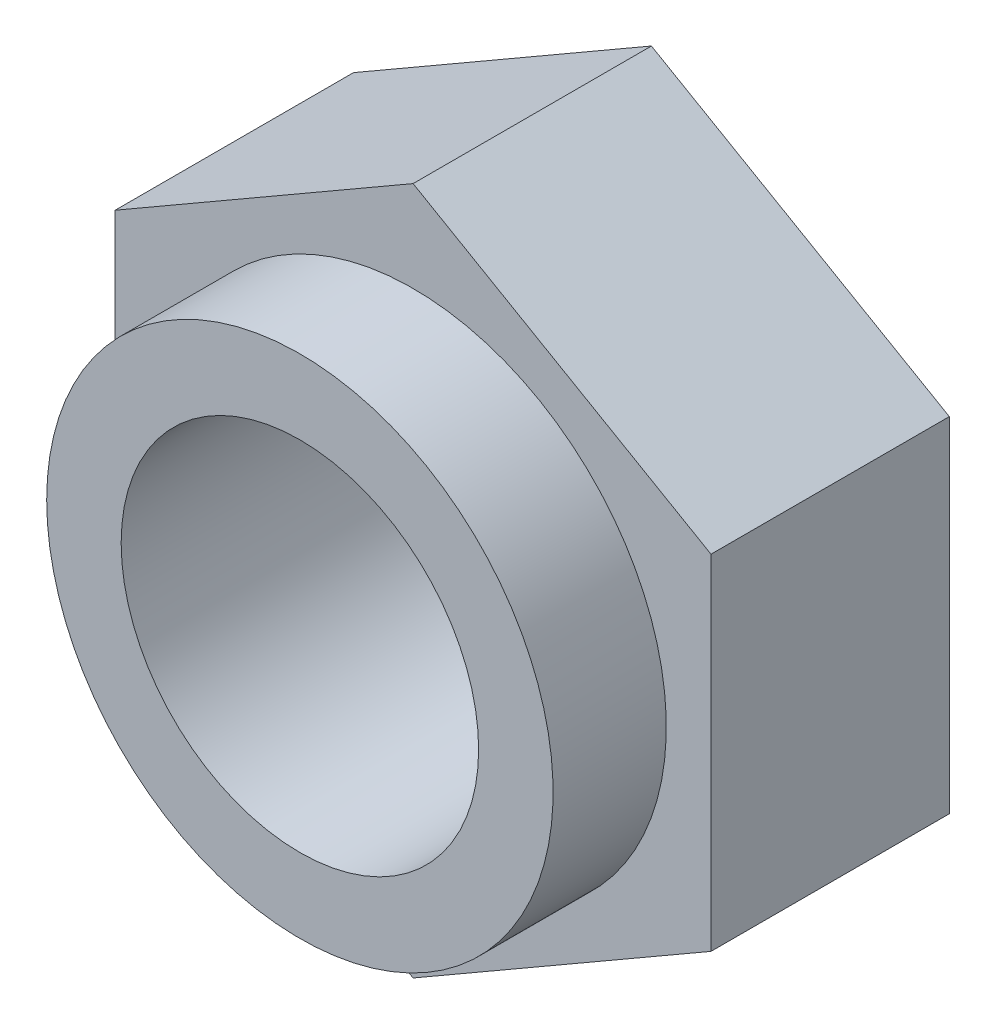
ISO-10303-21;
HEADER;
FILE_DESCRIPTION(('STEP AP214'),'2;1');
FILE_NAME('part.step','',(''),(''),'','','');
FILE_SCHEMA(('AUTOMOTIVE_DESIGN { 1 0 10303 214 1 1 1 1 }'));
ENDSEC;
DATA;
#1=APPLICATION_CONTEXT('core data for automotive mechanical design processes');
#2=APPLICATION_PROTOCOL_DEFINITION('international standard','automotive_design',2000,#1);
#3=PRODUCT_CONTEXT('',#1,'mechanical');
#4=PRODUCT('Part','Part','',(#3));
#5=PRODUCT_RELATED_PRODUCT_CATEGORY('part','',(#4));
#6=PRODUCT_DEFINITION_FORMATION('','',#4);
#7=PRODUCT_DEFINITION_CONTEXT('part definition',#1,'design');
#8=PRODUCT_DEFINITION('design','',#6,#7);
#9=PRODUCT_DEFINITION_SHAPE('','',#8);
#10=(LENGTH_UNIT() NAMED_UNIT(*) SI_UNIT(.MILLI.,.METRE.));
#11=(NAMED_UNIT(*) PLANE_ANGLE_UNIT() SI_UNIT($,.RADIAN.));
#12=(NAMED_UNIT(*) SI_UNIT($,.STERADIAN.) SOLID_ANGLE_UNIT());
#13=UNCERTAINTY_MEASURE_WITH_UNIT(LENGTH_MEASURE(1.E-05),#10,'distance_accuracy_value','');
#14=(GEOMETRIC_REPRESENTATION_CONTEXT(3) GLOBAL_UNCERTAINTY_ASSIGNED_CONTEXT((#13)) GLOBAL_UNIT_ASSIGNED_CONTEXT((#10,
#11,#12)) REPRESENTATION_CONTEXT('',''));
#15=CARTESIAN_POINT('',(0.,0.,0.));
#16=DIRECTION('',(0.,0.,1.));
#17=DIRECTION('',(1.,0.,0.));
#18=AXIS2_PLACEMENT_3D('',#15,#16,#17);
#19=CARTESIAN_POINT('',(4.99999999999996,2.88675134594818,4.));
#20=DIRECTION('',(-0.499999999999995,-0.866025403784441,0.));
#21=DIRECTION('',(0.866025403784442,-0.499999999999995,0.));
#22=AXIS2_PLACEMENT_3D('',#19,#20,#21);
#23=PLANE('',#22);
#24=DIRECTION('',(-0.866025403784441,0.499999999999995,0.));
#25=VECTOR('',#24,1.);
#26=CARTESIAN_POINT('',(4.99999999999996,2.88675134594818,0.));
#27=LINE('',#26,#25);
#28=CARTESIAN_POINT('',(4.99999999999996,2.88675134594818,0.));
#29=VERTEX_POINT('',#28);
#30=CARTESIAN_POINT('',(0.,5.77350269189625,0.));
#31=VERTEX_POINT('',#30);
#32=EDGE_CURVE('E120',#29,#31,#27,.T.);
#33=ORIENTED_EDGE('',*,*,#32,.T.);
#34=DIRECTION('',(0.,0.,-1.));
#35=VECTOR('',#34,1.);
#36=CARTESIAN_POINT('',(0.,5.77350269189625,4.));
#37=LINE('',#36,#35);
#38=CARTESIAN_POINT('',(0.,5.77350269189625,4.));
#39=VERTEX_POINT('',#38);
#40=EDGE_CURVE('E37',#39,#31,#37,.T.);
#41=ORIENTED_EDGE('',*,*,#40,.F.);
#42=DIRECTION('',(-0.866025403784441,0.499999999999995,0.));
#43=VECTOR('',#42,1.);
#44=CARTESIAN_POINT('',(4.99999999999996,2.88675134594818,4.));
#45=LINE('',#44,#43);
#46=CARTESIAN_POINT('',(4.99999999999996,2.88675134594818,4.));
#47=VERTEX_POINT('',#46);
#48=EDGE_CURVE('E131',#47,#39,#45,.T.);
#49=ORIENTED_EDGE('',*,*,#48,.F.);
#50=DIRECTION('',(0.,0.,-1.));
#51=VECTOR('',#50,1.);
#52=CARTESIAN_POINT('',(4.99999999999996,2.88675134594818,4.));
#53=LINE('',#52,#51);
#54=EDGE_CURVE('E116',#47,#29,#53,.T.);
#55=ORIENTED_EDGE('',*,*,#54,.T.);
#56=EDGE_LOOP('',(#33,#41,#49,#55));
#57=FACE_BOUND('',#56,.T.);
#58=ADVANCED_FACE('F34',(#57),#23,.F.);
#59=CARTESIAN_POINT('',(0.,5.77350269189625,4.));
#60=DIRECTION('',(0.500000000000001,-0.866025403784438,0.));
#61=DIRECTION('',(0.866025403784438,0.500000000000001,0.));
#62=AXIS2_PLACEMENT_3D('',#59,#60,#61);
#63=PLANE('',#62);
#64=DIRECTION('',(-0.866025403784438,-0.500000000000001,0.));
#65=VECTOR('',#64,1.);
#66=CARTESIAN_POINT('',(0.,5.77350269189625,0.));
#67=LINE('',#66,#65);
#68=CARTESIAN_POINT('',(-5.,2.88675134594811,0.));
#69=VERTEX_POINT('',#68);
#70=EDGE_CURVE('E123',#31,#69,#67,.T.);
#71=ORIENTED_EDGE('',*,*,#70,.T.);
#72=DIRECTION('',(0.,0.,-1.));
#73=VECTOR('',#72,1.);
#74=CARTESIAN_POINT('',(-5.,2.88675134594811,4.));
#75=LINE('',#74,#73);
#76=CARTESIAN_POINT('',(-5.,2.88675134594811,4.));
#77=VERTEX_POINT('',#76);
#78=EDGE_CURVE('E134',#77,#69,#75,.T.);
#79=ORIENTED_EDGE('',*,*,#78,.F.);
#80=DIRECTION('',(-0.866025403784438,-0.500000000000001,0.));
#81=VECTOR('',#80,1.);
#82=CARTESIAN_POINT('',(0.,5.77350269189625,4.));
#83=LINE('',#82,#81);
#84=EDGE_CURVE('E89',#39,#77,#83,.T.);
#85=ORIENTED_EDGE('',*,*,#84,.F.);
#86=ORIENTED_EDGE('',*,*,#40,.T.);
#87=EDGE_LOOP('',(#71,#79,#85,#86));
#88=FACE_BOUND('',#87,.T.);
#89=ADVANCED_FACE('F139',(#88),#63,.F.);
#90=CARTESIAN_POINT('',(-5.,2.88675134594811,4.));
#91=DIRECTION('',(1.,0.,0.));
#92=DIRECTION('',(0.,1.,0.));
#93=AXIS2_PLACEMENT_3D('',#90,#91,#92);
#94=PLANE('',#93);
#95=DIRECTION('',(0.,-1.,0.));
#96=VECTOR('',#95,1.);
#97=CARTESIAN_POINT('',(-5.,2.88675134594811,0.));
#98=LINE('',#97,#96);
#99=CARTESIAN_POINT('',(-4.99999999999998,-2.88675134594815,0.));
#100=VERTEX_POINT('',#99);
#101=EDGE_CURVE('E126',#69,#100,#98,.T.);
#102=ORIENTED_EDGE('',*,*,#101,.T.);
#103=DIRECTION('',(0.,0.,-1.));
#104=VECTOR('',#103,1.);
#105=CARTESIAN_POINT('',(-4.99999999999998,-2.88675134594815,4.));
#106=LINE('',#105,#104);
#107=CARTESIAN_POINT('',(-4.99999999999998,-2.88675134594815,4.));
#108=VERTEX_POINT('',#107);
#109=EDGE_CURVE('E111',#108,#100,#106,.T.);
#110=ORIENTED_EDGE('',*,*,#109,.F.);
#111=DIRECTION('',(0.,-1.,0.));
#112=VECTOR('',#111,1.);
#113=CARTESIAN_POINT('',(-5.,2.88675134594811,4.));
#114=LINE('',#113,#112);
#115=EDGE_CURVE('E102',#77,#108,#114,.T.);
#116=ORIENTED_EDGE('',*,*,#115,.F.);
#117=ORIENTED_EDGE('',*,*,#78,.T.);
#118=EDGE_LOOP('',(#102,#110,#116,#117));
#119=FACE_BOUND('',#118,.T.);
#120=ADVANCED_FACE('F145',(#119),#94,.F.);
#121=CARTESIAN_POINT('',(-4.99999999999998,-2.88675134594815,4.));
#122=DIRECTION('',(0.499999999999995,0.866025403784442,0.));
#123=DIRECTION('',(-0.866025403784442,0.499999999999995,0.));
#124=AXIS2_PLACEMENT_3D('',#121,#122,#123);
#125=PLANE('',#124);
#126=DIRECTION('',(0.866025403784441,-0.499999999999995,0.));
#127=VECTOR('',#126,1.);
#128=CARTESIAN_POINT('',(-4.99999999999998,-2.88675134594815,0.));
#129=LINE('',#128,#127);
#130=CARTESIAN_POINT('',(0.,-5.77350269189625,0.));
#131=VERTEX_POINT('',#130);
#132=EDGE_CURVE('E110',#100,#131,#129,.T.);
#133=ORIENTED_EDGE('',*,*,#132,.T.);
#134=DIRECTION('',(0.,0.,-1.));
#135=VECTOR('',#134,1.);
#136=CARTESIAN_POINT('',(0.,-5.77350269189625,4.));
#137=LINE('',#136,#135);
#138=CARTESIAN_POINT('',(0.,-5.77350269189625,4.));
#139=VERTEX_POINT('',#138);
#140=EDGE_CURVE('E107',#139,#131,#137,.T.);
#141=ORIENTED_EDGE('',*,*,#140,.F.);
#142=DIRECTION('',(0.866025403784441,-0.499999999999995,0.));
#143=VECTOR('',#142,1.);
#144=CARTESIAN_POINT('',(-4.99999999999998,-2.88675134594815,4.));
#145=LINE('',#144,#143);
#146=EDGE_CURVE('E96',#108,#139,#145,.T.);
#147=ORIENTED_EDGE('',*,*,#146,.F.);
#148=ORIENTED_EDGE('',*,*,#109,.T.);
#149=EDGE_LOOP('',(#133,#141,#147,#148));
#150=FACE_BOUND('',#149,.T.);
#151=ADVANCED_FACE('F108',(#150),#125,.F.);
#152=CARTESIAN_POINT('',(0.,-5.77350269189625,4.));
#153=DIRECTION('',(-0.500000000000007,0.866025403784435,0.));
#154=DIRECTION('',(-0.866025403784435,-0.500000000000007,0.));
#155=AXIS2_PLACEMENT_3D('',#152,#153,#154);
#156=PLANE('',#155);
#157=DIRECTION('',(0.866025403784435,0.500000000000007,0.));
#158=VECTOR('',#157,1.);
#159=CARTESIAN_POINT('',(0.,-5.77350269189625,0.));
#160=LINE('',#159,#158);
#161=CARTESIAN_POINT('',(5.00000000000002,-2.88675134594808,0.));
#162=VERTEX_POINT('',#161);
#163=EDGE_CURVE('E74',#131,#162,#160,.T.);
#164=ORIENTED_EDGE('',*,*,#163,.T.);
#165=DIRECTION('',(0.,0.,-1.));
#166=VECTOR('',#165,1.);
#167=CARTESIAN_POINT('',(5.00000000000002,-2.88675134594808,4.));
#168=LINE('',#167,#166);
#169=CARTESIAN_POINT('',(5.00000000000002,-2.88675134594808,4.));
#170=VERTEX_POINT('',#169);
#171=EDGE_CURVE('E112',#170,#162,#168,.T.);
#172=ORIENTED_EDGE('',*,*,#171,.F.);
#173=DIRECTION('',(0.866025403784435,0.500000000000007,0.));
#174=VECTOR('',#173,1.);
#175=CARTESIAN_POINT('',(0.,-5.77350269189625,4.));
#176=LINE('',#175,#174);
#177=EDGE_CURVE('E100',#139,#170,#176,.T.);
#178=ORIENTED_EDGE('',*,*,#177,.F.);
#179=ORIENTED_EDGE('',*,*,#140,.T.);
#180=EDGE_LOOP('',(#164,#172,#178,#179));
#181=FACE_BOUND('',#180,.T.);
#182=ADVANCED_FACE('F114',(#181),#156,.F.);
#183=CARTESIAN_POINT('',(5.00000000000002,-2.88675134594808,4.));
#184=DIRECTION('',(-1.,0.,0.));
#185=DIRECTION('',(0.,-1.,0.));
#186=AXIS2_PLACEMENT_3D('',#183,#184,#185);
#187=PLANE('',#186);
#188=DIRECTION('',(0.,1.,0.));
#189=VECTOR('',#188,1.);
#190=CARTESIAN_POINT('',(5.00000000000002,-2.88675134594808,0.));
#191=LINE('',#190,#189);
#192=EDGE_CURVE('E80',#162,#29,#191,.T.);
#193=ORIENTED_EDGE('',*,*,#192,.T.);
#194=ORIENTED_EDGE('',*,*,#54,.F.);
#195=DIRECTION('',(0.,1.,0.));
#196=VECTOR('',#195,1.);
#197=CARTESIAN_POINT('',(5.00000000000002,-2.88675134594808,4.));
#198=LINE('',#197,#196);
#199=EDGE_CURVE('E51',#170,#47,#198,.T.);
#200=ORIENTED_EDGE('',*,*,#199,.F.);
#201=ORIENTED_EDGE('',*,*,#171,.T.);
#202=EDGE_LOOP('',(#193,#194,#200,#201));
#203=FACE_BOUND('',#202,.T.);
#204=ADVANCED_FACE('F174',(#203),#187,.F.);
#205=CARTESIAN_POINT('',(0.,0.,4.));
#206=DIRECTION('',(0.,0.,1.));
#207=DIRECTION('',(1.,0.,0.));
#208=AXIS2_PLACEMENT_3D('',#205,#206,#207);
#209=PLANE('',#208);
#210=CARTESIAN_POINT('',(0.,0.,4.));
#211=DIRECTION('',(0.,0.,1.));
#212=DIRECTION('',(1.,0.,0.));
#213=AXIS2_PLACEMENT_3D('',#210,#211,#212);
#214=CIRCLE('',#213,4.25);
#215=CARTESIAN_POINT('',(-4.25,0.,4.));
#216=VERTEX_POINT('',#215);
#217=EDGE_CURVE('E11',#216,#216,#214,.T.);
#218=ORIENTED_EDGE('',*,*,#217,.F.);
#219=EDGE_LOOP('',(#218));
#220=FACE_BOUND('',#219,.T.);
#221=ORIENTED_EDGE('',*,*,#48,.T.);
#222=ORIENTED_EDGE('',*,*,#84,.T.);
#223=ORIENTED_EDGE('',*,*,#115,.T.);
#224=ORIENTED_EDGE('',*,*,#146,.T.);
#225=ORIENTED_EDGE('',*,*,#177,.T.);
#226=ORIENTED_EDGE('',*,*,#199,.T.);
#227=EDGE_LOOP('',(#221,#222,#223,#224,#225,#226));
#228=FACE_BOUND('',#227,.T.);
#229=ADVANCED_FACE('F98',(#220,#228),#209,.T.);
#230=CARTESIAN_POINT('',(0.,0.,0.));
#231=DIRECTION('',(0.,0.,1.));
#232=DIRECTION('',(1.,0.,0.));
#233=AXIS2_PLACEMENT_3D('',#230,#231,#232);
#234=PLANE('',#233);
#235=CARTESIAN_POINT('',(0.,0.,0.));
#236=DIRECTION('',(0.,0.,1.));
#237=DIRECTION('',(1.,0.,0.));
#238=AXIS2_PLACEMENT_3D('',#235,#236,#237);
#239=CIRCLE('',#238,3.);
#240=CARTESIAN_POINT('',(3.,0.,0.));
#241=VERTEX_POINT('',#240);
#242=EDGE_CURVE('E151',#241,#241,#239,.T.);
#243=ORIENTED_EDGE('',*,*,#242,.T.);
#244=EDGE_LOOP('',(#243));
#245=FACE_BOUND('',#244,.T.);
#246=ORIENTED_EDGE('',*,*,#32,.F.);
#247=ORIENTED_EDGE('',*,*,#192,.F.);
#248=ORIENTED_EDGE('',*,*,#163,.F.);
#249=ORIENTED_EDGE('',*,*,#132,.F.);
#250=ORIENTED_EDGE('',*,*,#101,.F.);
#251=ORIENTED_EDGE('',*,*,#70,.F.);
#252=EDGE_LOOP('',(#246,#247,#248,#249,#250,#251));
#253=FACE_BOUND('',#252,.T.);
#254=ADVANCED_FACE('F144',(#245,#253),#234,.F.);
#255=CARTESIAN_POINT('',(0.,0.,5.9));
#256=DIRECTION('',(0.,0.,-1.));
#257=DIRECTION('',(-1.,0.,0.));
#258=AXIS2_PLACEMENT_3D('',#255,#256,#257);
#259=CYLINDRICAL_SURFACE('',#258,4.25);
#260=CARTESIAN_POINT('',(0.,0.,5.9));
#261=DIRECTION('',(0.,0.,1.));
#262=DIRECTION('',(1.,0.,0.));
#263=AXIS2_PLACEMENT_3D('',#260,#261,#262);
#264=CIRCLE('',#263,4.25);
#265=CARTESIAN_POINT('',(-4.25,0.,5.9));
#266=VERTEX_POINT('',#265);
#267=EDGE_CURVE('E124',#266,#266,#264,.T.);
#268=CARTESIAN_POINT('',(-4.25,0.,5.9));
#269=CARTESIAN_POINT('',(-4.25,0.,5.88020833333333));
#270=CARTESIAN_POINT('',(-4.25,0.,5.86041666666667));
#271=CARTESIAN_POINT('',(-4.25,0.,5.82083333333333));
#272=CARTESIAN_POINT('',(-4.25,0.,5.80104166666667));
#273=CARTESIAN_POINT('',(-4.25,0.,5.76145833333333));
#274=CARTESIAN_POINT('',(-4.25,0.,5.74166666666667));
#275=CARTESIAN_POINT('',(-4.25,0.,5.70208333333333));
#276=CARTESIAN_POINT('',(-4.25,0.,5.68229166666667));
#277=CARTESIAN_POINT('',(-4.25,0.,5.64270833333333));
#278=CARTESIAN_POINT('',(-4.25,0.,5.62291666666667));
#279=CARTESIAN_POINT('',(-4.25,0.,5.58333333333333));
#280=CARTESIAN_POINT('',(-4.25,0.,5.56354166666667));
#281=CARTESIAN_POINT('',(-4.25,0.,5.52395833333333));
#282=CARTESIAN_POINT('',(-4.25,0.,5.50416666666667));
#283=CARTESIAN_POINT('',(-4.25,0.,5.46458333333333));
#284=CARTESIAN_POINT('',(-4.25,0.,5.44479166666667));
#285=CARTESIAN_POINT('',(-4.25,0.,5.40520833333333));
#286=CARTESIAN_POINT('',(-4.25,0.,5.38541666666667));
#287=CARTESIAN_POINT('',(-4.25,0.,5.34583333333333));
#288=CARTESIAN_POINT('',(-4.25,0.,5.32604166666667));
#289=CARTESIAN_POINT('',(-4.25,0.,5.28645833333333));
#290=CARTESIAN_POINT('',(-4.25,0.,5.26666666666667));
#291=CARTESIAN_POINT('',(-4.25,0.,5.22708333333333));
#292=CARTESIAN_POINT('',(-4.25,0.,5.20729166666667));
#293=CARTESIAN_POINT('',(-4.25,0.,5.16770833333333));
#294=CARTESIAN_POINT('',(-4.25,0.,5.14791666666667));
#295=CARTESIAN_POINT('',(-4.25,0.,5.10833333333333));
#296=CARTESIAN_POINT('',(-4.25,0.,5.08854166666667));
#297=CARTESIAN_POINT('',(-4.25,0.,5.04895833333333));
#298=CARTESIAN_POINT('',(-4.25,0.,5.02916666666667));
#299=CARTESIAN_POINT('',(-4.25,0.,4.98958333333333));
#300=CARTESIAN_POINT('',(-4.25,0.,4.96979166666667));
#301=CARTESIAN_POINT('',(-4.25,0.,4.93020833333333));
#302=CARTESIAN_POINT('',(-4.25,0.,4.91041666666667));
#303=CARTESIAN_POINT('',(-4.25,0.,4.87083333333333));
#304=CARTESIAN_POINT('',(-4.25,0.,4.85104166666667));
#305=CARTESIAN_POINT('',(-4.25,0.,4.81145833333333));
#306=CARTESIAN_POINT('',(-4.25,0.,4.79166666666667));
#307=CARTESIAN_POINT('',(-4.25,0.,4.75208333333333));
#308=CARTESIAN_POINT('',(-4.25,0.,4.73229166666667));
#309=CARTESIAN_POINT('',(-4.25,0.,4.69270833333333));
#310=CARTESIAN_POINT('',(-4.25,0.,4.67291666666667));
#311=CARTESIAN_POINT('',(-4.25,0.,4.63333333333333));
#312=CARTESIAN_POINT('',(-4.25,0.,4.61354166666667));
#313=CARTESIAN_POINT('',(-4.25,0.,4.57395833333333));
#314=CARTESIAN_POINT('',(-4.25,0.,4.55416666666667));
#315=CARTESIAN_POINT('',(-4.25,0.,4.51458333333333));
#316=CARTESIAN_POINT('',(-4.25,0.,4.49479166666667));
#317=CARTESIAN_POINT('',(-4.25,0.,4.45520833333333));
#318=CARTESIAN_POINT('',(-4.25,0.,4.43541666666667));
#319=CARTESIAN_POINT('',(-4.25,0.,4.39583333333333));
#320=CARTESIAN_POINT('',(-4.25,0.,4.37604166666667));
#321=CARTESIAN_POINT('',(-4.25,0.,4.33645833333333));
#322=CARTESIAN_POINT('',(-4.25,0.,4.31666666666667));
#323=CARTESIAN_POINT('',(-4.25,0.,4.27708333333333));
#324=CARTESIAN_POINT('',(-4.25,0.,4.25729166666667));
#325=CARTESIAN_POINT('',(-4.25,0.,4.21770833333333));
#326=CARTESIAN_POINT('',(-4.25,0.,4.19791666666667));
#327=CARTESIAN_POINT('',(-4.25,0.,4.15833333333333));
#328=CARTESIAN_POINT('',(-4.25,0.,4.13854166666667));
#329=CARTESIAN_POINT('',(-4.25,0.,4.09895833333333));
#330=CARTESIAN_POINT('',(-4.25,0.,4.07916666666667));
#331=CARTESIAN_POINT('',(-4.25,0.,4.03958333333333));
#332=CARTESIAN_POINT('',(-4.25,0.,4.01979166666667));
#333=CARTESIAN_POINT('',(-4.25,0.,4.));
#334=B_SPLINE_CURVE_WITH_KNOTS('',3,(#268,#269,#270,#271,#272,#273,#274,#275,#276,#277,#278,
#279,#280,#281,#282,#283,#284,#285,#286,#287,#288,#289,#290,#291,#292,#293,#294,#295,#296,#297,
#298,#299,#300,#301,#302,#303,#304,#305,#306,#307,#308,#309,#310,#311,#312,#313,#314,#315,#316,
#317,#318,#319,#320,#321,#322,#323,#324,#325,#326,#327,#328,#329,#330,#331,#332,#333),
.UNSPECIFIED.,.F.,.F.,(4,2,2,2,2,2,2,2,2,2,2,2,2,2,2,2,2,2,2,2,2,2,2,2,2,2,2,2,2,2,2,2,4),(0.,
0.0593749999999995,0.11875,0.178124999999999,0.2375,0.296874999999999,0.35625,0.415624999999999,
0.475,0.534374999999999,0.59375,0.653124999999999,0.7125,0.771875,0.831249999999999,0.890625,
0.95,1.009375,1.06875,1.128125,1.1875,1.246875,1.30625,1.365625,1.425,1.484375,1.54375,1.603125,
1.6625,1.721875,1.78125,1.840625,1.9),.UNSPECIFIED.);
#335=EDGE_CURVE('BSEAM164',#266,#216,#334,.T.);
#336=ORIENTED_EDGE('',*,*,#267,.F.);
#337=ORIENTED_EDGE('',*,*,#217,.T.);
#338=ORIENTED_EDGE('',*,*,#335,.T.);
#339=ORIENTED_EDGE('',*,*,#335,.F.);
#340=EDGE_LOOP('',(#336,#338,#337,#339));
#341=FACE_BOUND('',#340,.T.);
#342=ADVANCED_FACE('F164',(#341),#259,.T.);
#343=CARTESIAN_POINT('',(0.,0.,5.9));
#344=DIRECTION('',(0.,0.,1.));
#345=DIRECTION('',(1.,0.,0.));
#346=AXIS2_PLACEMENT_3D('',#343,#344,#345);
#347=PLANE('',#346);
#348=CARTESIAN_POINT('',(0.,0.,5.9));
#349=DIRECTION('',(0.,0.,1.));
#350=DIRECTION('',(1.,0.,0.));
#351=AXIS2_PLACEMENT_3D('',#348,#349,#350);
#352=CIRCLE('',#351,3.);
#353=CARTESIAN_POINT('',(3.,0.,5.9));
#354=VERTEX_POINT('',#353);
#355=EDGE_CURVE('E154',#354,#354,#352,.T.);
#356=ORIENTED_EDGE('',*,*,#355,.F.);
#357=EDGE_LOOP('',(#356));
#358=FACE_BOUND('',#357,.T.);
#359=ORIENTED_EDGE('',*,*,#267,.T.);
#360=EDGE_LOOP('',(#359));
#361=FACE_BOUND('',#360,.T.);
#362=ADVANCED_FACE('F161',(#358,#361),#347,.T.);
#363=CARTESIAN_POINT('',(0.,0.,-4.));
#364=DIRECTION('',(0.,0.,1.));
#365=DIRECTION('',(1.,0.,0.));
#366=AXIS2_PLACEMENT_3D('',#363,#364,#365);
#367=CYLINDRICAL_SURFACE('',#366,3.);
#368=CARTESIAN_POINT('',(3.,0.,5.9));
#369=CARTESIAN_POINT('',(3.,0.,5.83854166666667));
#370=CARTESIAN_POINT('',(3.,0.,5.77708333333333));
#371=CARTESIAN_POINT('',(3.,0.,5.65416666666667));
#372=CARTESIAN_POINT('',(3.,0.,5.59270833333333));
#373=CARTESIAN_POINT('',(3.,0.,5.46979166666667));
#374=CARTESIAN_POINT('',(3.,0.,5.40833333333333));
#375=CARTESIAN_POINT('',(3.,0.,5.28541666666667));
#376=CARTESIAN_POINT('',(3.,0.,5.22395833333333));
#377=CARTESIAN_POINT('',(3.,0.,5.10104166666667));
#378=CARTESIAN_POINT('',(3.,0.,5.03958333333333));
#379=CARTESIAN_POINT('',(3.,0.,4.91666666666667));
#380=CARTESIAN_POINT('',(3.,0.,4.85520833333333));
#381=CARTESIAN_POINT('',(3.,0.,4.73229166666667));
#382=CARTESIAN_POINT('',(3.,0.,4.67083333333333));
#383=CARTESIAN_POINT('',(3.,0.,4.54791666666667));
#384=CARTESIAN_POINT('',(3.,0.,4.48645833333333));
#385=CARTESIAN_POINT('',(3.,0.,4.36354166666667));
#386=CARTESIAN_POINT('',(3.,0.,4.30208333333333));
#387=CARTESIAN_POINT('',(3.,0.,4.17916666666667));
#388=CARTESIAN_POINT('',(3.,0.,4.11770833333333));
#389=CARTESIAN_POINT('',(3.,0.,3.99479166666667));
#390=CARTESIAN_POINT('',(3.,0.,3.93333333333333));
#391=CARTESIAN_POINT('',(3.,0.,3.81041666666667));
#392=CARTESIAN_POINT('',(3.,0.,3.74895833333333));
#393=CARTESIAN_POINT('',(3.,0.,3.62604166666667));
#394=CARTESIAN_POINT('',(3.,0.,3.56458333333333));
#395=CARTESIAN_POINT('',(3.,0.,3.44166666666667));
#396=CARTESIAN_POINT('',(3.,0.,3.38020833333333));
#397=CARTESIAN_POINT('',(3.,0.,3.25729166666667));
#398=CARTESIAN_POINT('',(3.,0.,3.19583333333333));
#399=CARTESIAN_POINT('',(3.,0.,3.07291666666667));
#400=CARTESIAN_POINT('',(3.,0.,3.01145833333333));
#401=CARTESIAN_POINT('',(3.,0.,2.88854166666667));
#402=CARTESIAN_POINT('',(3.,0.,2.82708333333333));
#403=CARTESIAN_POINT('',(3.,0.,2.70416666666667));
#404=CARTESIAN_POINT('',(3.,0.,2.64270833333333));
#405=CARTESIAN_POINT('',(3.,0.,2.51979166666667));
#406=CARTESIAN_POINT('',(3.,0.,2.45833333333333));
#407=CARTESIAN_POINT('',(3.,0.,2.33541666666667));
#408=CARTESIAN_POINT('',(3.,0.,2.27395833333333));
#409=CARTESIAN_POINT('',(3.,0.,2.15104166666667));
#410=CARTESIAN_POINT('',(3.,0.,2.08958333333333));
#411=CARTESIAN_POINT('',(3.,0.,1.96666666666667));
#412=CARTESIAN_POINT('',(3.,0.,1.90520833333333));
#413=CARTESIAN_POINT('',(3.,0.,1.78229166666667));
#414=CARTESIAN_POINT('',(3.,0.,1.72083333333333));
#415=CARTESIAN_POINT('',(3.,0.,1.59791666666667));
#416=CARTESIAN_POINT('',(3.,0.,1.53645833333333));
#417=CARTESIAN_POINT('',(3.,0.,1.41354166666667));
#418=CARTESIAN_POINT('',(3.,0.,1.35208333333333));
#419=CARTESIAN_POINT('',(3.,0.,1.22916666666667));
#420=CARTESIAN_POINT('',(3.,0.,1.16770833333333));
#421=CARTESIAN_POINT('',(3.,0.,1.04479166666667));
#422=CARTESIAN_POINT('',(3.,0.,0.983333333333334));
#423=CARTESIAN_POINT('',(3.,0.,0.860416666666667));
#424=CARTESIAN_POINT('',(3.,0.,0.798958333333334));
#425=CARTESIAN_POINT('',(3.,0.,0.676041666666667));
#426=CARTESIAN_POINT('',(3.,0.,0.614583333333333));
#427=CARTESIAN_POINT('',(3.,0.,0.491666666666667));
#428=CARTESIAN_POINT('',(3.,0.,0.430208333333333));
#429=CARTESIAN_POINT('',(3.,0.,0.307291666666667));
#430=CARTESIAN_POINT('',(3.,0.,0.245833333333333));
#431=CARTESIAN_POINT('',(3.,0.,0.122916666666666));
#432=CARTESIAN_POINT('',(3.,0.,0.0614583333333332));
#433=CARTESIAN_POINT('',(3.,0.,0.));
#434=B_SPLINE_CURVE_WITH_KNOTS('',3,(#368,#369,#370,#371,#372,#373,#374,#375,#376,#377,#378,
#379,#380,#381,#382,#383,#384,#385,#386,#387,#388,#389,#390,#391,#392,#393,#394,#395,#396,#397,
#398,#399,#400,#401,#402,#403,#404,#405,#406,#407,#408,#409,#410,#411,#412,#413,#414,#415,#416,
#417,#418,#419,#420,#421,#422,#423,#424,#425,#426,#427,#428,#429,#430,#431,#432,#433),
.UNSPECIFIED.,.F.,.F.,(4,2,2,2,2,2,2,2,2,2,2,2,2,2,2,2,2,2,2,2,2,2,2,2,2,2,2,2,2,2,2,2,4),(0.,
0.184375000000001,0.368749999999999,0.553125,0.7375,0.921875000000001,1.10625,1.290625,1.475,
1.659375,1.84375,2.028125,2.2125,2.396875,2.58125,2.765625,2.95,3.134375,3.31875,3.503125,
3.6875,3.871875,4.05625,4.240625,4.425,4.609375,4.79375,4.978125,5.1625,5.346875,5.53125,
5.715625,5.9),.UNSPECIFIED.);
#435=EDGE_CURVE('BSEAM158',#354,#241,#434,.T.);
#436=ORIENTED_EDGE('',*,*,#355,.T.);
#437=ORIENTED_EDGE('',*,*,#242,.F.);
#438=ORIENTED_EDGE('',*,*,#435,.T.);
#439=ORIENTED_EDGE('',*,*,#435,.F.);
#440=EDGE_LOOP('',(#436,#438,#437,#439));
#441=FACE_BOUND('',#440,.T.);
#442=ADVANCED_FACE('F158',(#441),#367,.F.);
#443=CLOSED_SHELL('',(#58,#89,#120,#151,#182,#204,#229,#254,#342,#362,#442));
#444=MANIFOLD_SOLID_BREP('B2',#443);
#445=ADVANCED_BREP_SHAPE_REPRESENTATION('',(#18,#444),#14);
#446=SHAPE_DEFINITION_REPRESENTATION(#9,#445);
ENDSEC;
END-ISO-10303-21;
